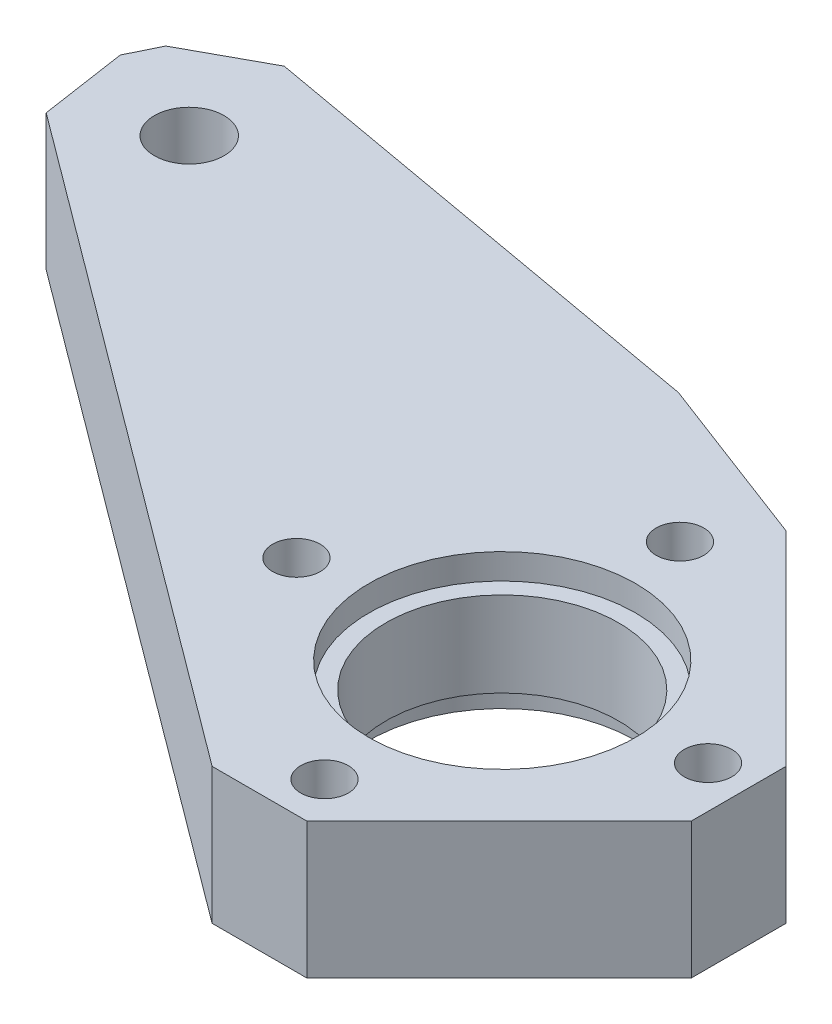
ISO-10303-21;
HEADER;
FILE_DESCRIPTION(('STEP AP214'),'2;1');
FILE_NAME('part.step','',(''),(''),'','','');
FILE_SCHEMA(('AUTOMOTIVE_DESIGN { 1 0 10303 214 1 1 1 1 }'));
ENDSEC;
DATA;
#1=APPLICATION_CONTEXT('core data for automotive mechanical design processes');
#2=APPLICATION_PROTOCOL_DEFINITION('international standard','automotive_design',2000,#1);
#3=PRODUCT_CONTEXT('',#1,'mechanical');
#4=PRODUCT('Part','Part','',(#3));
#5=PRODUCT_RELATED_PRODUCT_CATEGORY('part','',(#4));
#6=PRODUCT_DEFINITION_FORMATION('','',#4);
#7=PRODUCT_DEFINITION_CONTEXT('part definition',#1,'design');
#8=PRODUCT_DEFINITION('design','',#6,#7);
#9=PRODUCT_DEFINITION_SHAPE('','',#8);
#10=(LENGTH_UNIT() NAMED_UNIT(*) SI_UNIT(.MILLI.,.METRE.));
#11=(NAMED_UNIT(*) PLANE_ANGLE_UNIT() SI_UNIT($,.RADIAN.));
#12=(NAMED_UNIT(*) SI_UNIT($,.STERADIAN.) SOLID_ANGLE_UNIT());
#13=UNCERTAINTY_MEASURE_WITH_UNIT(LENGTH_MEASURE(1.E-05),#10,'distance_accuracy_value','');
#14=(GEOMETRIC_REPRESENTATION_CONTEXT(3) GLOBAL_UNCERTAINTY_ASSIGNED_CONTEXT((#13)) GLOBAL_UNIT_ASSIGNED_CONTEXT((#10,
#11,#12)) REPRESENTATION_CONTEXT('',''));
#15=CARTESIAN_POINT('',(0.,0.,0.));
#16=DIRECTION('',(0.,0.,1.));
#17=DIRECTION('',(1.,0.,0.));
#18=AXIS2_PLACEMENT_3D('',#15,#16,#17);
#19=CARTESIAN_POINT('',(0.,8.,0.));
#20=DIRECTION('',(0.,1.,0.));
#21=DIRECTION('',(0.,0.,1.));
#22=AXIS2_PLACEMENT_3D('',#19,#20,#21);
#23=PLANE('',#22);
#24=CARTESIAN_POINT('',(28.7668988959431,8.,-10.5233277372902));
#25=DIRECTION('',(0.,1.,0.));
#26=DIRECTION('',(0.,0.,1.));
#27=AXIS2_PLACEMENT_3D('',#24,#25,#26);
#28=CIRCLE('',#27,1.4);
#29=CARTESIAN_POINT('',(28.7668988959431,8.,-9.1233277372902));
#30=VERTEX_POINT('',#29);
#31=EDGE_CURVE('E251',#30,#30,#28,.F.);
#32=ORIENTED_EDGE('',*,*,#31,.T.);
#33=EDGE_LOOP('',(#32));
#34=FACE_BOUND('',#33,.T.);
#35=CARTESIAN_POINT('',(6.19988118314816,8.,-8.87114386423057));
#36=DIRECTION('',(0.,-1.,0.));
#37=DIRECTION('',(0.,0.,-1.));
#38=AXIS2_PLACEMENT_3D('',#35,#36,#37);
#39=CIRCLE('',#38,1.4);
#40=CARTESIAN_POINT('',(6.19988118314816,8.,-10.2711438642306));
#41=VERTEX_POINT('',#40);
#42=EDGE_CURVE('E245',#41,#41,#39,.T.);
#43=ORIENTED_EDGE('',*,*,#42,.T.);
#44=EDGE_LOOP('',(#43));
#45=FACE_BOUND('',#44,.T.);
#46=CARTESIAN_POINT('',(17.4833900395457,8.,-9.69723580076038));
#47=DIRECTION('',(0.,1.,0.));
#48=DIRECTION('',(0.,0.,1.));
#49=AXIS2_PLACEMENT_3D('',#46,#47,#48);
#50=CIRCLE('',#49,7.85);
#51=CARTESIAN_POINT('',(17.4833900395457,8.,-1.84723580076038));
#52=VERTEX_POINT('',#51);
#53=EDGE_CURVE('E215',#52,#52,#50,.T.);
#54=ORIENTED_EDGE('',*,*,#53,.F.);
#55=EDGE_LOOP('',(#54));
#56=FACE_BOUND('',#55,.T.);
#57=CARTESIAN_POINT('',(-18.4687183652912,8.,-27.2313711158211));
#58=DIRECTION('',(0.,1.,0.));
#59=DIRECTION('',(0.,0.,1.));
#60=AXIS2_PLACEMENT_3D('',#57,#58,#59);
#61=CIRCLE('',#60,2.05);
#62=CARTESIAN_POINT('',(-18.4687183652912,8.,-25.1813711158211));
#63=VERTEX_POINT('',#62);
#64=EDGE_CURVE('E209',#63,#63,#61,.T.);
#65=ORIENTED_EDGE('',*,*,#64,.F.);
#66=EDGE_LOOP('',(#65));
#67=FACE_BOUND('',#66,.T.);
#68=DIRECTION('',(0.,0.,-1.));
#69=VECTOR('',#68,1.);
#70=CARTESIAN_POINT('',(31.2261429026576,8.,-7.08081886042889));
#71=LINE('',#70,#69);
#72=CARTESIAN_POINT('',(31.2261429026576,8.,-7.08081886042889));
#73=VERTEX_POINT('',#72);
#74=CARTESIAN_POINT('',(31.2261429026576,8.,-12.6408188604289));
#75=VERTEX_POINT('',#74);
#76=EDGE_CURVE('E161',#73,#75,#71,.T.);
#77=ORIENTED_EDGE('',*,*,#76,.T.);
#78=DIRECTION('',(-0.707106781186547,0.,-0.707106781186548));
#79=VECTOR('',#78,1.);
#80=CARTESIAN_POINT('',(31.2261429026576,8.,-12.6408188604289));
#81=LINE('',#80,#79);
#82=CARTESIAN_POINT('',(19.2053276224863,8.,-24.6616341406002));
#83=VERTEX_POINT('',#82);
#84=EDGE_CURVE('E99',#75,#83,#81,.T.);
#85=ORIENTED_EDGE('',*,*,#84,.T.);
#86=DIRECTION('',(-0.934763684301212,0.,-0.355270114858573));
#87=VECTOR('',#86,1.);
#88=CARTESIAN_POINT('',(19.2053276224863,8.,-24.6616341406002));
#89=LINE('',#88,#87);
#90=CARTESIAN_POINT('',(9.01640346360313,8.,-28.5340783925587));
#91=VERTEX_POINT('',#90);
#92=EDGE_CURVE('E182',#83,#91,#89,.T.);
#93=ORIENTED_EDGE('',*,*,#92,.T.);
#94=DIRECTION('',(-0.984472557712064,0.,-0.175538551639994));
#95=VECTOR('',#94,1.);
#96=CARTESIAN_POINT('',(9.01640346360313,8.,-28.5340783925587));
#97=LINE('',#96,#95);
#98=CARTESIAN_POINT('',(-19.2182694915789,8.,-33.5685240535937));
#99=VERTEX_POINT('',#98);
#100=EDGE_CURVE('E201',#91,#99,#97,.T.);
#101=ORIENTED_EDGE('',*,*,#100,.T.);
#102=DIRECTION('',(-0.877973985573836,0.,0.478708346131122));
#103=VECTOR('',#102,1.);
#104=CARTESIAN_POINT('',(-23.7302667287928,8.,-31.1083933769847));
#105=LINE('',#104,#103);
#106=CARTESIAN_POINT('',(-23.7302667287928,8.,-31.1083933769847));
#107=VERTEX_POINT('',#106);
#108=EDGE_CURVE('E198',#99,#107,#105,.T.);
#109=ORIENTED_EDGE('',*,*,#108,.T.);
#110=DIRECTION('',(-0.438214270959038,0.,0.898870542807939));
#111=VECTOR('',#110,1.);
#112=CARTESIAN_POINT('',(-24.6066952707109,8.,-29.3106522913688));
#113=LINE('',#112,#111);
#114=CARTESIAN_POINT('',(-24.6066952707109,8.,-29.3106522913688));
#115=VERTEX_POINT('',#114);
#116=EDGE_CURVE('E200',#107,#115,#113,.T.);
#117=ORIENTED_EDGE('',*,*,#116,.T.);
#118=DIRECTION('',(0.147636793047511,0.,0.989041645907111));
#119=VECTOR('',#118,1.);
#120=CARTESIAN_POINT('',(-23.8419366827248,8.,-24.1874165655699));
#121=LINE('',#120,#119);
#122=CARTESIAN_POINT('',(-23.8419366827248,8.,-24.1874165655699));
#123=VERTEX_POINT('',#122);
#124=EDGE_CURVE('E124',#115,#123,#121,.T.);
#125=ORIENTED_EDGE('',*,*,#124,.T.);
#126=DIRECTION('',(0.802192669882305,0.,0.597065256389198));
#127=VECTOR('',#126,1.);
#128=CARTESIAN_POINT('',(14.3424344036729,8.,4.2328896385559));
#129=LINE('',#128,#127);
#130=CARTESIAN_POINT('',(14.3424344036729,8.,4.2328896385559));
#131=VERTEX_POINT('',#130);
#132=EDGE_CURVE('E118',#123,#131,#129,.T.);
#133=ORIENTED_EDGE('',*,*,#132,.T.);
#134=DIRECTION('',(1.,0.,0.));
#135=VECTOR('',#134,1.);
#136=CARTESIAN_POINT('',(19.9124344036729,8.,4.2328896385559));
#137=LINE('',#136,#135);
#138=CARTESIAN_POINT('',(19.9124344036729,8.,4.2328896385559));
#139=VERTEX_POINT('',#138);
#140=EDGE_CURVE('E122',#131,#139,#137,.T.);
#141=ORIENTED_EDGE('',*,*,#140,.T.);
#142=DIRECTION('',(0.707106781186546,0.,-0.707106781186549));
#143=VECTOR('',#142,1.);
#144=CARTESIAN_POINT('',(31.2261429026576,8.,-7.08081886042889));
#145=LINE('',#144,#143);
#146=EDGE_CURVE('E50',#139,#73,#145,.T.);
#147=ORIENTED_EDGE('',*,*,#146,.T.);
#148=EDGE_LOOP('',(#77,#85,#93,#101,#109,#117,#125,#133,#141,#147));
#149=FACE_BOUND('',#148,.T.);
#150=CARTESIAN_POINT('',(18.3094819760754,8.,1.5862730556371));
#151=DIRECTION('',(0.,1.,0.));
#152=DIRECTION('',(0.,0.,1.));
#153=AXIS2_PLACEMENT_3D('',#150,#151,#152);
#154=CIRCLE('',#153,1.39999999999999);
#155=CARTESIAN_POINT('',(18.3094819760754,8.,2.98627305563709));
#156=VERTEX_POINT('',#155);
#157=EDGE_CURVE('E248',#156,#156,#154,.T.);
#158=ORIENTED_EDGE('',*,*,#157,.F.);
#159=EDGE_LOOP('',(#158));
#160=FACE_BOUND('',#159,.T.);
#161=CARTESIAN_POINT('',(16.6572981030158,8.,-20.9807446571579));
#162=DIRECTION('',(0.,1.,0.));
#163=DIRECTION('',(0.,0.,1.));
#164=AXIS2_PLACEMENT_3D('',#161,#162,#163);
#165=CIRCLE('',#164,1.4);
#166=CARTESIAN_POINT('',(16.6572981030158,8.,-19.5807446571579));
#167=VERTEX_POINT('',#166);
#168=EDGE_CURVE('E237',#167,#167,#165,.T.);
#169=ORIENTED_EDGE('',*,*,#168,.F.);
#170=EDGE_LOOP('',(#169));
#171=FACE_BOUND('',#170,.T.);
#172=ADVANCED_FACE('F33',(#34,#45,#56,#67,#149,#160,#171),#23,.T.);
#173=CARTESIAN_POINT('',(0.,0.,0.));
#174=DIRECTION('',(0.,1.,0.));
#175=DIRECTION('',(0.,0.,1.));
#176=AXIS2_PLACEMENT_3D('',#173,#174,#175);
#177=PLANE('',#176);
#178=DIRECTION('',(0.,0.,-1.));
#179=VECTOR('',#178,1.);
#180=CARTESIAN_POINT('',(31.2261429026576,0.,-7.08081886042889));
#181=LINE('',#180,#179);
#182=CARTESIAN_POINT('',(31.2261429026576,0.,-7.08081886042889));
#183=VERTEX_POINT('',#182);
#184=CARTESIAN_POINT('',(31.2261429026576,0.,-12.6408188604289));
#185=VERTEX_POINT('',#184);
#186=EDGE_CURVE('E142',#183,#185,#181,.T.);
#187=ORIENTED_EDGE('',*,*,#186,.F.);
#188=DIRECTION('',(0.707106781186546,0.,-0.707106781186549));
#189=VECTOR('',#188,1.);
#190=CARTESIAN_POINT('',(31.2261429026576,0.,-7.08081886042889));
#191=LINE('',#190,#189);
#192=CARTESIAN_POINT('',(19.9124344036729,0.,4.2328896385559));
#193=VERTEX_POINT('',#192);
#194=EDGE_CURVE('E91',#193,#183,#191,.T.);
#195=ORIENTED_EDGE('',*,*,#194,.F.);
#196=DIRECTION('',(1.,0.,0.));
#197=VECTOR('',#196,1.);
#198=CARTESIAN_POINT('',(19.9124344036729,0.,4.2328896385559));
#199=LINE('',#198,#197);
#200=CARTESIAN_POINT('',(14.3424344036729,0.,4.2328896385559));
#201=VERTEX_POINT('',#200);
#202=EDGE_CURVE('E85',#201,#193,#199,.T.);
#203=ORIENTED_EDGE('',*,*,#202,.F.);
#204=DIRECTION('',(0.802192669882305,0.,0.597065256389198));
#205=VECTOR('',#204,1.);
#206=CARTESIAN_POINT('',(14.3424344036729,0.,4.2328896385559));
#207=LINE('',#206,#205);
#208=CARTESIAN_POINT('',(-23.8419366827248,0.,-24.1874165655699));
#209=VERTEX_POINT('',#208);
#210=EDGE_CURVE('E132',#209,#201,#207,.T.);
#211=ORIENTED_EDGE('',*,*,#210,.F.);
#212=DIRECTION('',(0.147636793047511,0.,0.989041645907111));
#213=VECTOR('',#212,1.);
#214=CARTESIAN_POINT('',(-23.8419366827248,0.,-24.1874165655699));
#215=LINE('',#214,#213);
#216=CARTESIAN_POINT('',(-24.6066952707109,0.,-29.3106522913688));
#217=VERTEX_POINT('',#216);
#218=EDGE_CURVE('E156',#217,#209,#215,.T.);
#219=ORIENTED_EDGE('',*,*,#218,.F.);
#220=DIRECTION('',(-0.438214270959038,0.,0.898870542807939));
#221=VECTOR('',#220,1.);
#222=CARTESIAN_POINT('',(-24.6066952707109,0.,-29.3106522913688));
#223=LINE('',#222,#221);
#224=CARTESIAN_POINT('',(-23.7302667287928,0.,-31.1083933769847));
#225=VERTEX_POINT('',#224);
#226=EDGE_CURVE('E154',#225,#217,#223,.T.);
#227=ORIENTED_EDGE('',*,*,#226,.F.);
#228=DIRECTION('',(-0.877973985573836,0.,0.478708346131122));
#229=VECTOR('',#228,1.);
#230=CARTESIAN_POINT('',(-23.7302667287928,0.,-31.1083933769847));
#231=LINE('',#230,#229);
#232=CARTESIAN_POINT('',(-19.2182694915789,0.,-33.5685240535937));
#233=VERTEX_POINT('',#232);
#234=EDGE_CURVE('E152',#233,#225,#231,.T.);
#235=ORIENTED_EDGE('',*,*,#234,.F.);
#236=DIRECTION('',(-0.984472557712064,0.,-0.175538551639994));
#237=VECTOR('',#236,1.);
#238=CARTESIAN_POINT('',(9.01640346360313,0.,-28.5340783925587));
#239=LINE('',#238,#237);
#240=CARTESIAN_POINT('',(9.01640346360313,0.,-28.5340783925587));
#241=VERTEX_POINT('',#240);
#242=EDGE_CURVE('E150',#241,#233,#239,.T.);
#243=ORIENTED_EDGE('',*,*,#242,.F.);
#244=DIRECTION('',(-0.934763684301212,0.,-0.355270114858573));
#245=VECTOR('',#244,1.);
#246=CARTESIAN_POINT('',(19.2053276224863,0.,-24.6616341406002));
#247=LINE('',#246,#245);
#248=CARTESIAN_POINT('',(19.2053276224863,0.,-24.6616341406002));
#249=VERTEX_POINT('',#248);
#250=EDGE_CURVE('E148',#249,#241,#247,.T.);
#251=ORIENTED_EDGE('',*,*,#250,.F.);
#252=DIRECTION('',(-0.707106781186547,0.,-0.707106781186548));
#253=VECTOR('',#252,1.);
#254=CARTESIAN_POINT('',(31.2261429026576,0.,-12.6408188604289));
#255=LINE('',#254,#253);
#256=EDGE_CURVE('E145',#185,#249,#255,.T.);
#257=ORIENTED_EDGE('',*,*,#256,.F.);
#258=EDGE_LOOP('',(#187,#195,#203,#211,#219,#227,#235,#243,#251,#257));
#259=FACE_BOUND('',#258,.T.);
#260=CARTESIAN_POINT('',(-18.4687183652912,0.,-27.2313711158211));
#261=DIRECTION('',(0.,1.,0.));
#262=DIRECTION('',(0.,0.,1.));
#263=AXIS2_PLACEMENT_3D('',#260,#261,#262);
#264=CIRCLE('',#263,2.05);
#265=CARTESIAN_POINT('',(-18.4687183652912,0.,-25.1813711158211));
#266=VERTEX_POINT('',#265);
#267=EDGE_CURVE('E146',#266,#266,#264,.T.);
#268=ORIENTED_EDGE('',*,*,#267,.T.);
#269=EDGE_LOOP('',(#268));
#270=FACE_BOUND('',#269,.T.);
#271=CARTESIAN_POINT('',(17.4833900395457,0.,-9.69723580076038));
#272=DIRECTION('',(0.,1.,0.));
#273=DIRECTION('',(0.,0.,1.));
#274=AXIS2_PLACEMENT_3D('',#271,#272,#273);
#275=CIRCLE('',#274,7.85);
#276=CARTESIAN_POINT('',(17.4833900395457,0.,-1.84723580076038));
#277=VERTEX_POINT('',#276);
#278=EDGE_CURVE('E224',#277,#277,#275,.T.);
#279=ORIENTED_EDGE('',*,*,#278,.T.);
#280=EDGE_LOOP('',(#279));
#281=FACE_BOUND('',#280,.T.);
#282=CARTESIAN_POINT('',(16.6572981030158,0.,-20.9807446571579));
#283=DIRECTION('',(0.,1.,0.));
#284=DIRECTION('',(0.,0.,1.));
#285=AXIS2_PLACEMENT_3D('',#282,#283,#284);
#286=CIRCLE('',#285,1.4);
#287=CARTESIAN_POINT('',(16.6572981030158,0.,-19.5807446571579));
#288=VERTEX_POINT('',#287);
#289=EDGE_CURVE('E232',#288,#288,#286,.T.);
#290=ORIENTED_EDGE('',*,*,#289,.T.);
#291=EDGE_LOOP('',(#290));
#292=FACE_BOUND('',#291,.T.);
#293=CARTESIAN_POINT('',(28.7668988959431,0.,-10.5233277372902));
#294=DIRECTION('',(0.,1.,0.));
#295=DIRECTION('',(0.,0.,-1.));
#296=AXIS2_PLACEMENT_3D('',#293,#294,#295);
#297=CIRCLE('',#296,1.4);
#298=CARTESIAN_POINT('',(28.7668988959431,0.,-11.9233277372902));
#299=VERTEX_POINT('',#298);
#300=EDGE_CURVE('E240',#299,#299,#297,.T.);
#301=ORIENTED_EDGE('',*,*,#300,.T.);
#302=EDGE_LOOP('',(#301));
#303=FACE_BOUND('',#302,.T.);
#304=CARTESIAN_POINT('',(6.19988118314816,0.,-8.87114386423057));
#305=DIRECTION('',(0.,1.,0.));
#306=DIRECTION('',(0.,0.,-1.));
#307=AXIS2_PLACEMENT_3D('',#304,#305,#306);
#308=CIRCLE('',#307,1.4);
#309=CARTESIAN_POINT('',(6.19988118314816,0.,-10.2711438642306));
#310=VERTEX_POINT('',#309);
#311=EDGE_CURVE('E236',#310,#310,#308,.T.);
#312=ORIENTED_EDGE('',*,*,#311,.T.);
#313=EDGE_LOOP('',(#312));
#314=FACE_BOUND('',#313,.T.);
#315=CARTESIAN_POINT('',(18.3094819760754,0.,1.5862730556371));
#316=DIRECTION('',(0.,1.,0.));
#317=DIRECTION('',(0.,0.,1.));
#318=AXIS2_PLACEMENT_3D('',#315,#316,#317);
#319=CIRCLE('',#318,1.39999999999999);
#320=CARTESIAN_POINT('',(18.3094819760754,0.,2.98627305563709));
#321=VERTEX_POINT('',#320);
#322=EDGE_CURVE('E233',#321,#321,#319,.T.);
#323=ORIENTED_EDGE('',*,*,#322,.T.);
#324=EDGE_LOOP('',(#323));
#325=FACE_BOUND('',#324,.T.);
#326=ADVANCED_FACE('F186',(#259,#270,#281,#292,#303,#314,#325),#177,.F.);
#327=CARTESIAN_POINT('',(17.4833900395457,0.,-9.69723580076038));
#328=DIRECTION('',(0.,1.,0.));
#329=DIRECTION('',(0.,0.,1.));
#330=AXIS2_PLACEMENT_3D('',#327,#328,#329);
#331=CYLINDRICAL_SURFACE('',#330,6.85);
#332=CARTESIAN_POINT('',(17.4833900395457,1.5,-9.69723580076038));
#333=DIRECTION('',(0.,1.,0.));
#334=DIRECTION('',(0.,0.,1.));
#335=AXIS2_PLACEMENT_3D('',#332,#333,#334);
#336=CIRCLE('',#335,6.85);
#337=CARTESIAN_POINT('',(17.4833900395457,1.5,-2.84723580076038));
#338=VERTEX_POINT('',#337);
#339=EDGE_CURVE('E227',#338,#338,#336,.T.);
#340=ORIENTED_EDGE('',*,*,#339,.F.);
#341=EDGE_LOOP('',(#340));
#342=FACE_BOUND('',#341,.T.);
#343=CARTESIAN_POINT('',(17.4833900395457,6.5,-9.69723580076038));
#344=DIRECTION('',(0.,1.,0.));
#345=DIRECTION('',(0.,0.,1.));
#346=AXIS2_PLACEMENT_3D('',#343,#344,#345);
#347=CIRCLE('',#346,6.85);
#348=CARTESIAN_POINT('',(17.4833900395457,6.5,-2.84723580076038));
#349=VERTEX_POINT('',#348);
#350=EDGE_CURVE('E218',#349,#349,#347,.T.);
#351=ORIENTED_EDGE('',*,*,#350,.T.);
#352=EDGE_LOOP('',(#351));
#353=FACE_BOUND('',#352,.T.);
#354=ADVANCED_FACE('F265',(#342,#353),#331,.F.);
#355=CARTESIAN_POINT('',(31.2261429026576,8.,-7.08081886042889));
#356=DIRECTION('',(-1.,0.,0.));
#357=DIRECTION('',(0.,0.,1.));
#358=AXIS2_PLACEMENT_3D('',#355,#356,#357);
#359=PLANE('',#358);
#360=ORIENTED_EDGE('',*,*,#186,.T.);
#361=DIRECTION('',(0.,-1.,0.));
#362=VECTOR('',#361,1.);
#363=CARTESIAN_POINT('',(31.2261429026576,8.,-12.6408188604289));
#364=LINE('',#363,#362);
#365=EDGE_CURVE('E11',#75,#185,#364,.T.);
#366=ORIENTED_EDGE('',*,*,#365,.F.);
#367=ORIENTED_EDGE('',*,*,#76,.F.);
#368=DIRECTION('',(0.,-1.,0.));
#369=VECTOR('',#368,1.);
#370=CARTESIAN_POINT('',(31.2261429026576,8.,-7.08081886042889));
#371=LINE('',#370,#369);
#372=EDGE_CURVE('E138',#73,#183,#371,.T.);
#373=ORIENTED_EDGE('',*,*,#372,.T.);
#374=EDGE_LOOP('',(#360,#366,#367,#373));
#375=FACE_BOUND('',#374,.T.);
#376=ADVANCED_FACE('F35',(#375),#359,.F.);
#377=CARTESIAN_POINT('',(31.2261429026576,8.,-12.6408188604289));
#378=DIRECTION('',(-0.707106781186548,0.,0.707106781186547));
#379=DIRECTION('',(0.707106781186547,0.,0.707106781186548));
#380=AXIS2_PLACEMENT_3D('',#377,#378,#379);
#381=PLANE('',#380);
#382=ORIENTED_EDGE('',*,*,#256,.T.);
#383=DIRECTION('',(0.,-1.,0.));
#384=VECTOR('',#383,1.);
#385=CARTESIAN_POINT('',(19.2053276224863,8.,-24.6616341406002));
#386=LINE('',#385,#384);
#387=EDGE_CURVE('E42',#83,#249,#386,.T.);
#388=ORIENTED_EDGE('',*,*,#387,.F.);
#389=ORIENTED_EDGE('',*,*,#84,.F.);
#390=ORIENTED_EDGE('',*,*,#365,.T.);
#391=EDGE_LOOP('',(#382,#388,#389,#390));
#392=FACE_BOUND('',#391,.T.);
#393=ADVANCED_FACE('F292',(#392),#381,.F.);
#394=CARTESIAN_POINT('',(19.2053276224863,8.,-24.6616341406002));
#395=DIRECTION('',(-0.355270114858573,0.,0.934763684301212));
#396=DIRECTION('',(0.934763684301212,0.,0.355270114858573));
#397=AXIS2_PLACEMENT_3D('',#394,#395,#396);
#398=PLANE('',#397);
#399=ORIENTED_EDGE('',*,*,#250,.T.);
#400=DIRECTION('',(0.,-1.,0.));
#401=VECTOR('',#400,1.);
#402=CARTESIAN_POINT('',(9.01640346360313,8.,-28.5340783925587));
#403=LINE('',#402,#401);
#404=EDGE_CURVE('E174',#91,#241,#403,.T.);
#405=ORIENTED_EDGE('',*,*,#404,.F.);
#406=ORIENTED_EDGE('',*,*,#92,.F.);
#407=ORIENTED_EDGE('',*,*,#387,.T.);
#408=EDGE_LOOP('',(#399,#405,#406,#407));
#409=FACE_BOUND('',#408,.T.);
#410=ADVANCED_FACE('F180',(#409),#398,.F.);
#411=CARTESIAN_POINT('',(9.01640346360313,8.,-28.5340783925587));
#412=DIRECTION('',(-0.175538551639994,0.,0.984472557712064));
#413=DIRECTION('',(0.984472557712064,0.,0.175538551639994));
#414=AXIS2_PLACEMENT_3D('',#411,#412,#413);
#415=PLANE('',#414);
#416=ORIENTED_EDGE('',*,*,#242,.T.);
#417=DIRECTION('',(0.,-1.,0.));
#418=VECTOR('',#417,1.);
#419=CARTESIAN_POINT('',(-19.2182694915789,8.,-33.5685240535937));
#420=LINE('',#419,#418);
#421=EDGE_CURVE('E171',#99,#233,#420,.T.);
#422=ORIENTED_EDGE('',*,*,#421,.F.);
#423=ORIENTED_EDGE('',*,*,#100,.F.);
#424=ORIENTED_EDGE('',*,*,#404,.T.);
#425=EDGE_LOOP('',(#416,#422,#423,#424));
#426=FACE_BOUND('',#425,.T.);
#427=ADVANCED_FACE('F192',(#426),#415,.F.);
#428=CARTESIAN_POINT('',(-23.7302667287928,8.,-31.1083933769847));
#429=DIRECTION('',(0.478708346131122,0.,0.877973985573836));
#430=DIRECTION('',(0.877973985573836,0.,-0.478708346131122));
#431=AXIS2_PLACEMENT_3D('',#428,#429,#430);
#432=PLANE('',#431);
#433=ORIENTED_EDGE('',*,*,#234,.T.);
#434=DIRECTION('',(0.,-1.,0.));
#435=VECTOR('',#434,1.);
#436=CARTESIAN_POINT('',(-23.7302667287928,8.,-31.1083933769847));
#437=LINE('',#436,#435);
#438=EDGE_CURVE('E168',#107,#225,#437,.T.);
#439=ORIENTED_EDGE('',*,*,#438,.F.);
#440=ORIENTED_EDGE('',*,*,#108,.F.);
#441=ORIENTED_EDGE('',*,*,#421,.T.);
#442=EDGE_LOOP('',(#433,#439,#440,#441));
#443=FACE_BOUND('',#442,.T.);
#444=ADVANCED_FACE('F196',(#443),#432,.F.);
#445=CARTESIAN_POINT('',(-24.6066952707109,8.,-29.3106522913688));
#446=DIRECTION('',(0.898870542807939,0.,0.438214270959038));
#447=DIRECTION('',(0.438214270959038,0.,-0.898870542807939));
#448=AXIS2_PLACEMENT_3D('',#445,#446,#447);
#449=PLANE('',#448);
#450=ORIENTED_EDGE('',*,*,#226,.T.);
#451=DIRECTION('',(0.,-1.,0.));
#452=VECTOR('',#451,1.);
#453=CARTESIAN_POINT('',(-24.6066952707109,8.,-29.3106522913688));
#454=LINE('',#453,#452);
#455=EDGE_CURVE('E165',#115,#217,#454,.T.);
#456=ORIENTED_EDGE('',*,*,#455,.F.);
#457=ORIENTED_EDGE('',*,*,#116,.F.);
#458=ORIENTED_EDGE('',*,*,#438,.T.);
#459=EDGE_LOOP('',(#450,#456,#457,#458));
#460=FACE_BOUND('',#459,.T.);
#461=ADVANCED_FACE('F282',(#460),#449,.F.);
#462=CARTESIAN_POINT('',(-23.8419366827248,8.,-24.1874165655699));
#463=DIRECTION('',(0.989041645907111,0.,-0.147636793047511));
#464=DIRECTION('',(-0.147636793047511,0.,-0.989041645907111));
#465=AXIS2_PLACEMENT_3D('',#462,#463,#464);
#466=PLANE('',#465);
#467=ORIENTED_EDGE('',*,*,#218,.T.);
#468=DIRECTION('',(0.,-1.,0.));
#469=VECTOR('',#468,1.);
#470=CARTESIAN_POINT('',(-23.8419366827248,8.,-24.1874165655699));
#471=LINE('',#470,#469);
#472=EDGE_CURVE('E133',#123,#209,#471,.T.);
#473=ORIENTED_EDGE('',*,*,#472,.F.);
#474=ORIENTED_EDGE('',*,*,#124,.F.);
#475=ORIENTED_EDGE('',*,*,#455,.T.);
#476=EDGE_LOOP('',(#467,#473,#474,#475));
#477=FACE_BOUND('',#476,.T.);
#478=ADVANCED_FACE('F279',(#477),#466,.F.);
#479=CARTESIAN_POINT('',(14.3424344036729,8.,4.2328896385559));
#480=DIRECTION('',(0.597065256389198,0.,-0.802192669882305));
#481=DIRECTION('',(-0.802192669882305,0.,-0.597065256389198));
#482=AXIS2_PLACEMENT_3D('',#479,#480,#481);
#483=PLANE('',#482);
#484=ORIENTED_EDGE('',*,*,#210,.T.);
#485=DIRECTION('',(0.,-1.,0.));
#486=VECTOR('',#485,1.);
#487=CARTESIAN_POINT('',(14.3424344036729,8.,4.2328896385559));
#488=LINE('',#487,#486);
#489=EDGE_CURVE('E129',#131,#201,#488,.T.);
#490=ORIENTED_EDGE('',*,*,#489,.F.);
#491=ORIENTED_EDGE('',*,*,#132,.F.);
#492=ORIENTED_EDGE('',*,*,#472,.T.);
#493=EDGE_LOOP('',(#484,#490,#491,#492));
#494=FACE_BOUND('',#493,.T.);
#495=ADVANCED_FACE('F130',(#494),#483,.F.);
#496=CARTESIAN_POINT('',(19.9124344036729,8.,4.2328896385559));
#497=DIRECTION('',(0.,0.,-1.));
#498=DIRECTION('',(-1.,0.,0.));
#499=AXIS2_PLACEMENT_3D('',#496,#497,#498);
#500=PLANE('',#499);
#501=ORIENTED_EDGE('',*,*,#202,.T.);
#502=DIRECTION('',(0.,-1.,0.));
#503=VECTOR('',#502,1.);
#504=CARTESIAN_POINT('',(19.9124344036729,8.,4.2328896385559));
#505=LINE('',#504,#503);
#506=EDGE_CURVE('E134',#139,#193,#505,.T.);
#507=ORIENTED_EDGE('',*,*,#506,.F.);
#508=ORIENTED_EDGE('',*,*,#140,.F.);
#509=ORIENTED_EDGE('',*,*,#489,.T.);
#510=EDGE_LOOP('',(#501,#507,#508,#509));
#511=FACE_BOUND('',#510,.T.);
#512=ADVANCED_FACE('F136',(#511),#500,.F.);
#513=CARTESIAN_POINT('',(31.2261429026576,8.,-7.08081886042889));
#514=DIRECTION('',(-0.707106781186549,0.,-0.707106781186546));
#515=DIRECTION('',(-0.707106781186546,0.,0.707106781186549));
#516=AXIS2_PLACEMENT_3D('',#513,#514,#515);
#517=PLANE('',#516);
#518=ORIENTED_EDGE('',*,*,#194,.T.);
#519=ORIENTED_EDGE('',*,*,#372,.F.);
#520=ORIENTED_EDGE('',*,*,#146,.F.);
#521=ORIENTED_EDGE('',*,*,#506,.T.);
#522=EDGE_LOOP('',(#518,#519,#520,#521));
#523=FACE_BOUND('',#522,.T.);
#524=ADVANCED_FACE('F271',(#523),#517,.F.);
#525=CARTESIAN_POINT('',(-18.4687183652912,0.,-27.2313711158211));
#526=DIRECTION('',(0.,1.,0.));
#527=DIRECTION('',(0.,0.,1.));
#528=AXIS2_PLACEMENT_3D('',#525,#526,#527);
#529=CYLINDRICAL_SURFACE('',#528,2.05);
#530=ORIENTED_EDGE('',*,*,#64,.T.);
#531=EDGE_LOOP('',(#530));
#532=FACE_BOUND('',#531,.T.);
#533=ORIENTED_EDGE('',*,*,#267,.F.);
#534=EDGE_LOOP('',(#533));
#535=FACE_BOUND('',#534,.T.);
#536=ADVANCED_FACE('F274',(#532,#535),#529,.F.);
#537=CARTESIAN_POINT('',(17.4833900395457,6.5,-9.69723580076038));
#538=DIRECTION('',(0.,1.,0.));
#539=DIRECTION('',(0.,0.,1.));
#540=AXIS2_PLACEMENT_3D('',#537,#538,#539);
#541=CYLINDRICAL_SURFACE('',#540,7.85);
#542=CARTESIAN_POINT('',(17.4833900395457,6.5,-9.69723580076038));
#543=DIRECTION('',(0.,1.,0.));
#544=DIRECTION('',(0.,0.,1.));
#545=AXIS2_PLACEMENT_3D('',#542,#543,#544);
#546=CIRCLE('',#545,7.85);
#547=CARTESIAN_POINT('',(17.4833900395457,6.5,-1.84723580076038));
#548=VERTEX_POINT('',#547);
#549=EDGE_CURVE('E212',#548,#548,#546,.T.);
#550=ORIENTED_EDGE('',*,*,#549,.F.);
#551=EDGE_LOOP('',(#550));
#552=FACE_BOUND('',#551,.T.);
#553=ORIENTED_EDGE('',*,*,#53,.T.);
#554=EDGE_LOOP('',(#553));
#555=FACE_BOUND('',#554,.T.);
#556=ADVANCED_FACE('F316',(#552,#555),#541,.F.);
#557=CARTESIAN_POINT('',(0.,6.5,0.));
#558=DIRECTION('',(0.,1.,0.));
#559=DIRECTION('',(0.,0.,1.));
#560=AXIS2_PLACEMENT_3D('',#557,#558,#559);
#561=PLANE('',#560);
#562=ORIENTED_EDGE('',*,*,#350,.F.);
#563=EDGE_LOOP('',(#562));
#564=FACE_BOUND('',#563,.T.);
#565=ORIENTED_EDGE('',*,*,#549,.T.);
#566=EDGE_LOOP('',(#565));
#567=FACE_BOUND('',#566,.T.);
#568=ADVANCED_FACE('F312',(#564,#567),#561,.T.);
#569=CARTESIAN_POINT('',(17.4833900395457,1.5,-9.69723580076038));
#570=DIRECTION('',(0.,1.,0.));
#571=DIRECTION('',(0.,0.,1.));
#572=AXIS2_PLACEMENT_3D('',#569,#570,#571);
#573=PLANE('',#572);
#574=CARTESIAN_POINT('',(17.4833900395457,1.5,-9.69723580076038));
#575=DIRECTION('',(0.,1.,0.));
#576=DIRECTION('',(0.,0.,1.));
#577=AXIS2_PLACEMENT_3D('',#574,#575,#576);
#578=CIRCLE('',#577,7.85);
#579=CARTESIAN_POINT('',(17.4833900395457,1.5,-1.84723580076038));
#580=VERTEX_POINT('',#579);
#581=EDGE_CURVE('E219',#580,#580,#578,.T.);
#582=ORIENTED_EDGE('',*,*,#581,.F.);
#583=EDGE_LOOP('',(#582));
#584=FACE_BOUND('',#583,.T.);
#585=ORIENTED_EDGE('',*,*,#339,.T.);
#586=EDGE_LOOP('',(#585));
#587=FACE_BOUND('',#586,.T.);
#588=ADVANCED_FACE('F315',(#584,#587),#573,.F.);
#589=CARTESIAN_POINT('',(17.4833900395457,1.5,-9.69723580076038));
#590=DIRECTION('',(0.,-1.,0.));
#591=DIRECTION('',(0.,0.,-1.));
#592=AXIS2_PLACEMENT_3D('',#589,#590,#591);
#593=CYLINDRICAL_SURFACE('',#592,7.85);
#594=ORIENTED_EDGE('',*,*,#581,.T.);
#595=EDGE_LOOP('',(#594));
#596=FACE_BOUND('',#595,.T.);
#597=ORIENTED_EDGE('',*,*,#278,.F.);
#598=EDGE_LOOP('',(#597));
#599=FACE_BOUND('',#598,.T.);
#600=ADVANCED_FACE('F358',(#596,#599),#593,.F.);
#601=CARTESIAN_POINT('',(16.6572981030158,1.5,-20.9807446571579));
#602=DIRECTION('',(0.,-1.,0.));
#603=DIRECTION('',(0.,0.,-1.));
#604=AXIS2_PLACEMENT_3D('',#601,#602,#603);
#605=CYLINDRICAL_SURFACE('',#604,1.4);
#606=ORIENTED_EDGE('',*,*,#289,.F.);
#607=EDGE_LOOP('',(#606));
#608=FACE_BOUND('',#607,.T.);
#609=ORIENTED_EDGE('',*,*,#168,.T.);
#610=EDGE_LOOP('',(#609));
#611=FACE_BOUND('',#610,.T.);
#612=ADVANCED_FACE('F257',(#608,#611),#605,.F.);
#613=CARTESIAN_POINT('',(28.7668988959431,1.5,-10.5233277372902));
#614=DIRECTION('',(0.,-1.,0.));
#615=DIRECTION('',(0.,0.,-1.));
#616=AXIS2_PLACEMENT_3D('',#613,#614,#615);
#617=CYLINDRICAL_SURFACE('',#616,1.4);
#618=ORIENTED_EDGE('',*,*,#300,.F.);
#619=EDGE_LOOP('',(#618));
#620=FACE_BOUND('',#619,.T.);
#621=ORIENTED_EDGE('',*,*,#31,.F.);
#622=EDGE_LOOP('',(#621));
#623=FACE_BOUND('',#622,.T.);
#624=ADVANCED_FACE('F351',(#620,#623),#617,.F.);
#625=CARTESIAN_POINT('',(6.19988118314816,1.5,-8.87114386423057));
#626=DIRECTION('',(0.,-1.,0.));
#627=DIRECTION('',(0.,0.,-1.));
#628=AXIS2_PLACEMENT_3D('',#625,#626,#627);
#629=CYLINDRICAL_SURFACE('',#628,1.4);
#630=ORIENTED_EDGE('',*,*,#311,.F.);
#631=EDGE_LOOP('',(#630));
#632=FACE_BOUND('',#631,.T.);
#633=ORIENTED_EDGE('',*,*,#42,.F.);
#634=EDGE_LOOP('',(#633));
#635=FACE_BOUND('',#634,.T.);
#636=ADVANCED_FACE('F345',(#632,#635),#629,.F.);
#637=CARTESIAN_POINT('',(18.3094819760754,1.5,1.5862730556371));
#638=DIRECTION('',(0.,-1.,0.));
#639=DIRECTION('',(0.,0.,-1.));
#640=AXIS2_PLACEMENT_3D('',#637,#638,#639);
#641=CYLINDRICAL_SURFACE('',#640,1.39999999999999);
#642=ORIENTED_EDGE('',*,*,#322,.F.);
#643=EDGE_LOOP('',(#642));
#644=FACE_BOUND('',#643,.T.);
#645=ORIENTED_EDGE('',*,*,#157,.T.);
#646=EDGE_LOOP('',(#645));
#647=FACE_BOUND('',#646,.T.);
#648=ADVANCED_FACE('F342',(#644,#647),#641,.F.);
#649=CLOSED_SHELL('',(#172,#326,#354,#376,#393,#410,#427,#444,#461,#478,#495,#512,#524,#536,
#556,#568,#588,#600,#612,#624,#636,#648));
#650=MANIFOLD_SOLID_BREP('B2',#649);
#651=ADVANCED_BREP_SHAPE_REPRESENTATION('',(#18,#650),#14);
#652=SHAPE_DEFINITION_REPRESENTATION(#9,#651);
ENDSEC;
END-ISO-10303-21;
